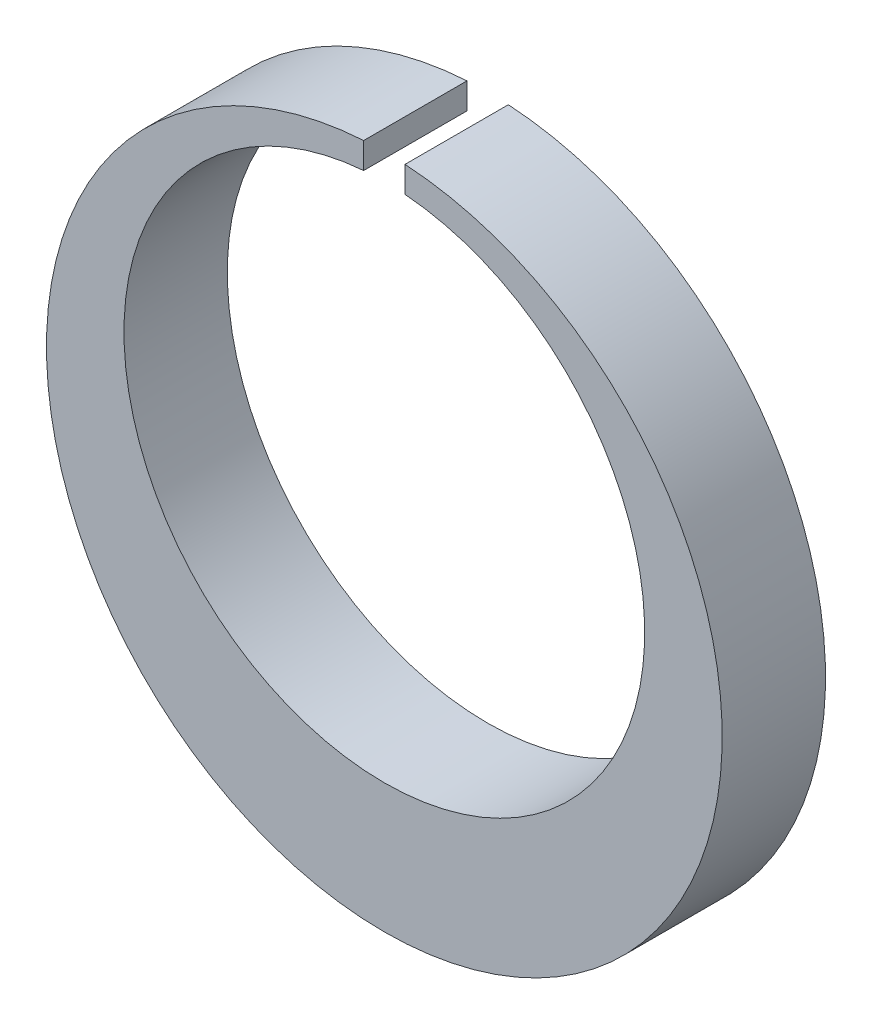
ISO-10303-21;
HEADER;
FILE_DESCRIPTION(('STEP AP214'),'2;1');
FILE_NAME('part.step','',(''),(''),'','','');
FILE_SCHEMA(('AUTOMOTIVE_DESIGN { 1 0 10303 214 1 1 1 1 }'));
ENDSEC;
DATA;
#1=APPLICATION_CONTEXT('core data for automotive mechanical design processes');
#2=APPLICATION_PROTOCOL_DEFINITION('international standard','automotive_design',2000,#1);
#3=PRODUCT_CONTEXT('',#1,'mechanical');
#4=PRODUCT('Part','Part','',(#3));
#5=PRODUCT_RELATED_PRODUCT_CATEGORY('part','',(#4));
#6=PRODUCT_DEFINITION_FORMATION('','',#4);
#7=PRODUCT_DEFINITION_CONTEXT('part definition',#1,'design');
#8=PRODUCT_DEFINITION('design','',#6,#7);
#9=PRODUCT_DEFINITION_SHAPE('','',#8);
#10=(LENGTH_UNIT() NAMED_UNIT(*) SI_UNIT(.MILLI.,.METRE.));
#11=(NAMED_UNIT(*) PLANE_ANGLE_UNIT() SI_UNIT($,.RADIAN.));
#12=(NAMED_UNIT(*) SI_UNIT($,.STERADIAN.) SOLID_ANGLE_UNIT());
#13=UNCERTAINTY_MEASURE_WITH_UNIT(LENGTH_MEASURE(1.E-05),#10,'distance_accuracy_value','');
#14=(GEOMETRIC_REPRESENTATION_CONTEXT(3) GLOBAL_UNCERTAINTY_ASSIGNED_CONTEXT((#13)) GLOBAL_UNIT_ASSIGNED_CONTEXT((#10,
#11,#12)) REPRESENTATION_CONTEXT('',''));
#15=CARTESIAN_POINT('',(0.,0.,0.));
#16=DIRECTION('',(0.,0.,1.));
#17=DIRECTION('',(1.,0.,0.));
#18=AXIS2_PLACEMENT_3D('',#15,#16,#17);
#19=CARTESIAN_POINT('',(-2.54,41.4512513803866,12.7));
#20=DIRECTION('',(1.,0.,0.));
#21=DIRECTION('',(0.,0.,-1.));
#22=AXIS2_PLACEMENT_3D('',#19,#20,#21);
#23=PLANE('',#22);
#24=DIRECTION('',(0.,-1.,0.));
#25=VECTOR('',#24,1.);
#26=CARTESIAN_POINT('',(-2.54,41.4512513803866,0.));
#27=LINE('',#26,#25);
#28=CARTESIAN_POINT('',(-2.54,41.4512513803866,0.));
#29=VERTEX_POINT('',#28);
#30=CARTESIAN_POINT('',(-2.54,38.2530471271946,0.));
#31=VERTEX_POINT('',#30);
#32=EDGE_CURVE('E99',#29,#31,#27,.T.);
#33=ORIENTED_EDGE('',*,*,#32,.F.);
#34=DIRECTION('',(0.,0.,-1.));
#35=VECTOR('',#34,1.);
#36=CARTESIAN_POINT('',(-2.54,41.4512513803866,12.7));
#37=LINE('',#36,#35);
#38=CARTESIAN_POINT('',(-2.54,41.4512513803866,12.7));
#39=VERTEX_POINT('',#38);
#40=EDGE_CURVE('E11',#39,#29,#37,.T.);
#41=ORIENTED_EDGE('',*,*,#40,.F.);
#42=DIRECTION('',(0.,-1.,0.));
#43=VECTOR('',#42,1.);
#44=CARTESIAN_POINT('',(-2.54,41.4512513803866,12.7));
#45=LINE('',#44,#43);
#46=CARTESIAN_POINT('',(-2.54,38.2530471271946,12.7));
#47=VERTEX_POINT('',#46);
#48=EDGE_CURVE('E94',#39,#47,#45,.T.);
#49=ORIENTED_EDGE('',*,*,#48,.T.);
#50=DIRECTION('',(0.,0.,-1.));
#51=VECTOR('',#50,1.);
#52=CARTESIAN_POINT('',(-2.54,38.2530471271946,12.7));
#53=LINE('',#52,#51);
#54=EDGE_CURVE('E37',#47,#31,#53,.T.);
#55=ORIENTED_EDGE('',*,*,#54,.T.);
#56=EDGE_LOOP('',(#33,#41,#49,#55));
#57=FACE_BOUND('',#56,.T.);
#58=ADVANCED_FACE('F34',(#57),#23,.T.);
#59=CARTESIAN_POINT('',(0.,0.,12.7));
#60=DIRECTION('',(0.,0.,-1.));
#61=DIRECTION('',(-1.,0.,0.));
#62=AXIS2_PLACEMENT_3D('',#59,#60,#61);
#63=CYLINDRICAL_SURFACE('',#62,41.529);
#64=CARTESIAN_POINT('',(0.,0.,0.));
#65=DIRECTION('',(0.,0.,1.));
#66=DIRECTION('',(1.,0.,0.));
#67=AXIS2_PLACEMENT_3D('',#64,#65,#66);
#68=CIRCLE('',#67,41.529);
#69=CARTESIAN_POINT('',(2.54,41.4512513803866,0.));
#70=VERTEX_POINT('',#69);
#71=EDGE_CURVE('E67',#29,#70,#68,.T.);
#72=ORIENTED_EDGE('',*,*,#71,.T.);
#73=DIRECTION('',(0.,0.,-1.));
#74=VECTOR('',#73,1.);
#75=CARTESIAN_POINT('',(2.54,41.4512513803866,12.7));
#76=LINE('',#75,#74);
#77=CARTESIAN_POINT('',(2.54,41.4512513803866,12.7));
#78=VERTEX_POINT('',#77);
#79=EDGE_CURVE('E43',#78,#70,#76,.T.);
#80=ORIENTED_EDGE('',*,*,#79,.F.);
#81=CARTESIAN_POINT('',(0.,0.,12.7));
#82=DIRECTION('',(0.,0.,1.));
#83=DIRECTION('',(1.,0.,0.));
#84=AXIS2_PLACEMENT_3D('',#81,#82,#83);
#85=CIRCLE('',#84,41.529);
#86=EDGE_CURVE('E84',#39,#78,#85,.T.);
#87=ORIENTED_EDGE('',*,*,#86,.F.);
#88=ORIENTED_EDGE('',*,*,#40,.T.);
#89=EDGE_LOOP('',(#72,#80,#87,#88));
#90=FACE_BOUND('',#89,.T.);
#91=ADVANCED_FACE('F109',(#90),#63,.T.);
#92=CARTESIAN_POINT('',(2.54,41.4512513803866,12.7));
#93=DIRECTION('',(1.,0.,0.));
#94=DIRECTION('',(0.,0.,-1.));
#95=AXIS2_PLACEMENT_3D('',#92,#93,#94);
#96=PLANE('',#95);
#97=DIRECTION('',(0.,-1.,0.));
#98=VECTOR('',#97,1.);
#99=CARTESIAN_POINT('',(2.54,41.4512513803866,0.));
#100=LINE('',#99,#98);
#101=CARTESIAN_POINT('',(2.54000000000001,38.2530471271946,0.));
#102=VERTEX_POINT('',#101);
#103=EDGE_CURVE('E91',#70,#102,#100,.T.);
#104=ORIENTED_EDGE('',*,*,#103,.T.);
#105=DIRECTION('',(0.,0.,-1.));
#106=VECTOR('',#105,1.);
#107=CARTESIAN_POINT('',(2.54000000000001,38.2530471271946,12.7));
#108=LINE('',#107,#106);
#109=CARTESIAN_POINT('',(2.54000000000001,38.2530471271946,12.7));
#110=VERTEX_POINT('',#109);
#111=EDGE_CURVE('E88',#110,#102,#108,.T.);
#112=ORIENTED_EDGE('',*,*,#111,.F.);
#113=DIRECTION('',(0.,-1.,0.));
#114=VECTOR('',#113,1.);
#115=CARTESIAN_POINT('',(2.54,41.4512513803866,12.7));
#116=LINE('',#115,#114);
#117=EDGE_CURVE('E79',#78,#110,#116,.T.);
#118=ORIENTED_EDGE('',*,*,#117,.F.);
#119=ORIENTED_EDGE('',*,*,#79,.T.);
#120=EDGE_LOOP('',(#104,#112,#118,#119));
#121=FACE_BOUND('',#120,.T.);
#122=ADVANCED_FACE('F89',(#121),#96,.F.);
#123=CARTESIAN_POINT('',(0.,6.34999999999999,12.7));
#124=DIRECTION('',(0.,0.,-1.));
#125=DIRECTION('',(-1.,0.,0.));
#126=AXIS2_PLACEMENT_3D('',#123,#124,#125);
#127=CYLINDRICAL_SURFACE('',#126,32.004);
#128=CARTESIAN_POINT('',(0.,6.34999999999999,0.));
#129=DIRECTION('',(0.,0.,1.));
#130=DIRECTION('',(1.,0.,0.));
#131=AXIS2_PLACEMENT_3D('',#128,#129,#130);
#132=CIRCLE('',#131,32.004);
#133=EDGE_CURVE('E102',#31,#102,#132,.T.);
#134=ORIENTED_EDGE('',*,*,#133,.F.);
#135=ORIENTED_EDGE('',*,*,#54,.F.);
#136=CARTESIAN_POINT('',(0.,6.34999999999999,12.7));
#137=DIRECTION('',(0.,0.,1.));
#138=DIRECTION('',(1.,0.,0.));
#139=AXIS2_PLACEMENT_3D('',#136,#137,#138);
#140=CIRCLE('',#139,32.004);
#141=EDGE_CURVE('E83',#47,#110,#140,.T.);
#142=ORIENTED_EDGE('',*,*,#141,.T.);
#143=ORIENTED_EDGE('',*,*,#111,.T.);
#144=EDGE_LOOP('',(#134,#135,#142,#143));
#145=FACE_BOUND('',#144,.T.);
#146=ADVANCED_FACE('F93',(#145),#127,.F.);
#147=CARTESIAN_POINT('',(0.,6.34999999999999,12.7));
#148=DIRECTION('',(0.,0.,1.));
#149=DIRECTION('',(1.,0.,0.));
#150=AXIS2_PLACEMENT_3D('',#147,#148,#149);
#151=PLANE('',#150);
#152=ORIENTED_EDGE('',*,*,#48,.F.);
#153=ORIENTED_EDGE('',*,*,#86,.T.);
#154=ORIENTED_EDGE('',*,*,#117,.T.);
#155=ORIENTED_EDGE('',*,*,#141,.F.);
#156=EDGE_LOOP('',(#152,#153,#154,#155));
#157=FACE_BOUND('',#156,.T.);
#158=ADVANCED_FACE('F82',(#157),#151,.T.);
#159=CARTESIAN_POINT('',(0.,6.34999999999999,0.));
#160=DIRECTION('',(0.,0.,1.));
#161=DIRECTION('',(1.,0.,0.));
#162=AXIS2_PLACEMENT_3D('',#159,#160,#161);
#163=PLANE('',#162);
#164=ORIENTED_EDGE('',*,*,#32,.T.);
#165=ORIENTED_EDGE('',*,*,#133,.T.);
#166=ORIENTED_EDGE('',*,*,#103,.F.);
#167=ORIENTED_EDGE('',*,*,#71,.F.);
#168=EDGE_LOOP('',(#164,#165,#166,#167));
#169=FACE_BOUND('',#168,.T.);
#170=ADVANCED_FACE('F107',(#169),#163,.F.);
#171=CLOSED_SHELL('',(#58,#91,#122,#146,#158,#170));
#172=MANIFOLD_SOLID_BREP('B2',#171);
#173=ADVANCED_BREP_SHAPE_REPRESENTATION('',(#18,#172),#14);
#174=SHAPE_DEFINITION_REPRESENTATION(#9,#173);
ENDSEC;
END-ISO-10303-21;
